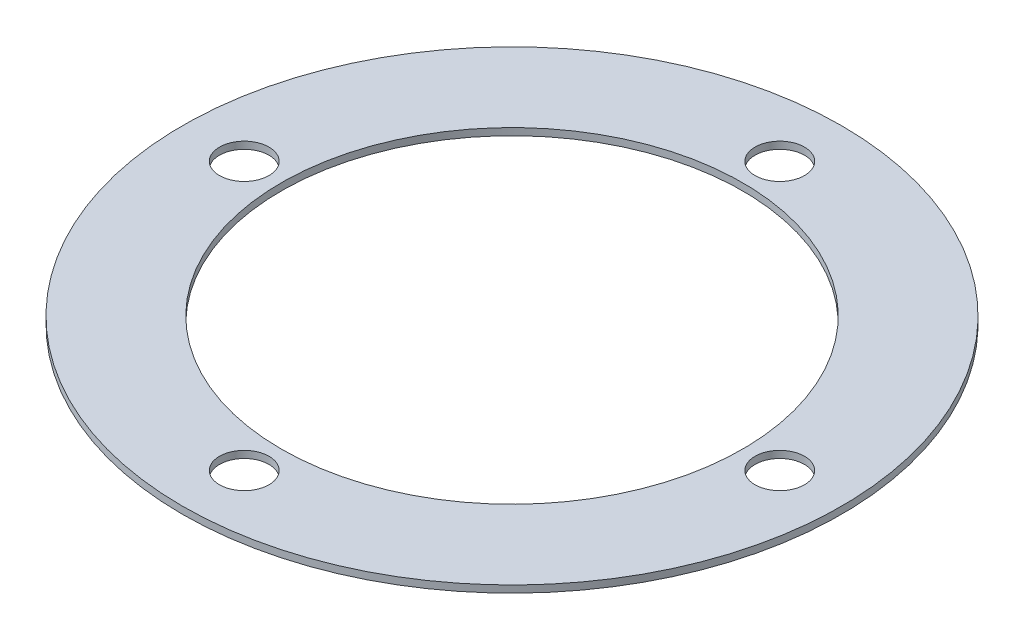
ISO-10303-21;
HEADER;
FILE_DESCRIPTION(('STEP AP214'),'2;1');
FILE_NAME('part.step','',(''),(''),'','','');
FILE_SCHEMA(('AUTOMOTIVE_DESIGN { 1 0 10303 214 1 1 1 1 }'));
ENDSEC;
DATA;
#1=APPLICATION_CONTEXT('core data for automotive mechanical design processes');
#2=APPLICATION_PROTOCOL_DEFINITION('international standard','automotive_design',2000,#1);
#3=PRODUCT_CONTEXT('',#1,'mechanical');
#4=PRODUCT('Part','Part','',(#3));
#5=PRODUCT_RELATED_PRODUCT_CATEGORY('part','',(#4));
#6=PRODUCT_DEFINITION_FORMATION('','',#4);
#7=PRODUCT_DEFINITION_CONTEXT('part definition',#1,'design');
#8=PRODUCT_DEFINITION('design','',#6,#7);
#9=PRODUCT_DEFINITION_SHAPE('','',#8);
#10=(LENGTH_UNIT() NAMED_UNIT(*) SI_UNIT(.MILLI.,.METRE.));
#11=(NAMED_UNIT(*) PLANE_ANGLE_UNIT() SI_UNIT($,.RADIAN.));
#12=(NAMED_UNIT(*) SI_UNIT($,.STERADIAN.) SOLID_ANGLE_UNIT());
#13=UNCERTAINTY_MEASURE_WITH_UNIT(LENGTH_MEASURE(1.E-05),#10,'distance_accuracy_value','');
#14=(GEOMETRIC_REPRESENTATION_CONTEXT(3) GLOBAL_UNCERTAINTY_ASSIGNED_CONTEXT((#13)) GLOBAL_UNIT_ASSIGNED_CONTEXT((#10,
#11,#12)) REPRESENTATION_CONTEXT('',''));
#15=CARTESIAN_POINT('',(0.,0.,0.));
#16=DIRECTION('',(0.,0.,1.));
#17=DIRECTION('',(1.,0.,0.));
#18=AXIS2_PLACEMENT_3D('',#15,#16,#17);
#19=CARTESIAN_POINT('',(32.5,0.86,0.));
#20=DIRECTION('',(0.,-1.,0.));
#21=DIRECTION('',(0.,0.,-1.));
#22=AXIS2_PLACEMENT_3D('',#19,#20,#21);
#23=CYLINDRICAL_SURFACE('',#22,3.);
#24=CARTESIAN_POINT('',(32.5,0.86,0.));
#25=DIRECTION('',(0.,1.,0.));
#26=DIRECTION('',(0.,0.,1.));
#27=AXIS2_PLACEMENT_3D('',#24,#25,#26);
#28=CIRCLE('',#27,3.);
#29=CARTESIAN_POINT('',(32.5,0.86,3.));
#30=VERTEX_POINT('',#29);
#31=EDGE_CURVE('E41',#30,#30,#28,.T.);
#32=ORIENTED_EDGE('',*,*,#31,.T.);
#33=EDGE_LOOP('',(#32));
#34=FACE_BOUND('',#33,.T.);
#35=CARTESIAN_POINT('',(32.5,0.,0.));
#36=DIRECTION('',(0.,1.,0.));
#37=DIRECTION('',(0.,0.,1.));
#38=AXIS2_PLACEMENT_3D('',#35,#36,#37);
#39=CIRCLE('',#38,3.);
#40=CARTESIAN_POINT('',(32.5,0.,3.));
#41=VERTEX_POINT('',#40);
#42=EDGE_CURVE('E61',#41,#41,#39,.T.);
#43=ORIENTED_EDGE('',*,*,#42,.F.);
#44=EDGE_LOOP('',(#43));
#45=FACE_BOUND('',#44,.T.);
#46=ADVANCED_FACE('F33',(#34,#45),#23,.F.);
#47=CARTESIAN_POINT('',(0.,0.86,32.5));
#48=DIRECTION('',(0.,-1.,0.));
#49=DIRECTION('',(0.,0.,-1.));
#50=AXIS2_PLACEMENT_3D('',#47,#48,#49);
#51=CYLINDRICAL_SURFACE('',#50,3.);
#52=CARTESIAN_POINT('',(0.,0.86,32.5));
#53=DIRECTION('',(0.,1.,0.));
#54=DIRECTION('',(0.,0.,1.));
#55=AXIS2_PLACEMENT_3D('',#52,#53,#54);
#56=CIRCLE('',#55,3.);
#57=CARTESIAN_POINT('',(0.,0.86,35.5));
#58=VERTEX_POINT('',#57);
#59=EDGE_CURVE('E46',#58,#58,#56,.T.);
#60=ORIENTED_EDGE('',*,*,#59,.T.);
#61=EDGE_LOOP('',(#60));
#62=FACE_BOUND('',#61,.T.);
#63=CARTESIAN_POINT('',(0.,0.,32.5));
#64=DIRECTION('',(0.,1.,0.));
#65=DIRECTION('',(0.,0.,1.));
#66=AXIS2_PLACEMENT_3D('',#63,#64,#65);
#67=CIRCLE('',#66,3.);
#68=CARTESIAN_POINT('',(0.,0.,35.5));
#69=VERTEX_POINT('',#68);
#70=EDGE_CURVE('E59',#69,#69,#67,.T.);
#71=ORIENTED_EDGE('',*,*,#70,.F.);
#72=EDGE_LOOP('',(#71));
#73=FACE_BOUND('',#72,.T.);
#74=ADVANCED_FACE('F82',(#62,#73),#51,.F.);
#75=CARTESIAN_POINT('',(-32.5,0.86,0.));
#76=DIRECTION('',(0.,-1.,0.));
#77=DIRECTION('',(0.,0.,-1.));
#78=AXIS2_PLACEMENT_3D('',#75,#76,#77);
#79=CYLINDRICAL_SURFACE('',#78,3.);
#80=CARTESIAN_POINT('',(-32.5,0.86,0.));
#81=DIRECTION('',(0.,1.,0.));
#82=DIRECTION('',(0.,0.,1.));
#83=AXIS2_PLACEMENT_3D('',#80,#81,#82);
#84=CIRCLE('',#83,3.);
#85=CARTESIAN_POINT('',(-32.5,0.86,3.));
#86=VERTEX_POINT('',#85);
#87=EDGE_CURVE('E75',#86,#86,#84,.T.);
#88=ORIENTED_EDGE('',*,*,#87,.T.);
#89=EDGE_LOOP('',(#88));
#90=FACE_BOUND('',#89,.T.);
#91=CARTESIAN_POINT('',(-32.5,0.,0.));
#92=DIRECTION('',(0.,1.,0.));
#93=DIRECTION('',(0.,0.,1.));
#94=AXIS2_PLACEMENT_3D('',#91,#92,#93);
#95=CIRCLE('',#94,3.);
#96=CARTESIAN_POINT('',(-32.5,0.,3.));
#97=VERTEX_POINT('',#96);
#98=EDGE_CURVE('E56',#97,#97,#95,.T.);
#99=ORIENTED_EDGE('',*,*,#98,.F.);
#100=EDGE_LOOP('',(#99));
#101=FACE_BOUND('',#100,.T.);
#102=ADVANCED_FACE('F100',(#90,#101),#79,.F.);
#103=CARTESIAN_POINT('',(0.,0.86,-32.5));
#104=DIRECTION('',(0.,-1.,0.));
#105=DIRECTION('',(0.,0.,-1.));
#106=AXIS2_PLACEMENT_3D('',#103,#104,#105);
#107=CYLINDRICAL_SURFACE('',#106,3.);
#108=CARTESIAN_POINT('',(0.,0.86,-32.5));
#109=DIRECTION('',(0.,1.,0.));
#110=DIRECTION('',(0.,0.,1.));
#111=AXIS2_PLACEMENT_3D('',#108,#109,#110);
#112=CIRCLE('',#111,3.);
#113=CARTESIAN_POINT('',(0.,0.86,-29.5));
#114=VERTEX_POINT('',#113);
#115=EDGE_CURVE('E70',#114,#114,#112,.T.);
#116=ORIENTED_EDGE('',*,*,#115,.T.);
#117=EDGE_LOOP('',(#116));
#118=FACE_BOUND('',#117,.T.);
#119=CARTESIAN_POINT('',(0.,0.,-32.5));
#120=DIRECTION('',(0.,1.,0.));
#121=DIRECTION('',(0.,0.,1.));
#122=AXIS2_PLACEMENT_3D('',#119,#120,#121);
#123=CIRCLE('',#122,3.);
#124=CARTESIAN_POINT('',(0.,0.,-29.5));
#125=VERTEX_POINT('',#124);
#126=EDGE_CURVE('E53',#125,#125,#123,.T.);
#127=ORIENTED_EDGE('',*,*,#126,.F.);
#128=EDGE_LOOP('',(#127));
#129=FACE_BOUND('',#128,.T.);
#130=ADVANCED_FACE('F106',(#118,#129),#107,.F.);
#131=CARTESIAN_POINT('',(0.,0.86,0.));
#132=DIRECTION('',(0.,-1.,0.));
#133=DIRECTION('',(0.,0.,-1.));
#134=AXIS2_PLACEMENT_3D('',#131,#132,#133);
#135=CYLINDRICAL_SURFACE('',#134,28.);
#136=CARTESIAN_POINT('',(0.,0.86,0.));
#137=DIRECTION('',(0.,1.,0.));
#138=DIRECTION('',(0.,0.,1.));
#139=AXIS2_PLACEMENT_3D('',#136,#137,#138);
#140=CIRCLE('',#139,28.);
#141=CARTESIAN_POINT('',(0.,0.86,28.));
#142=VERTEX_POINT('',#141);
#143=EDGE_CURVE('E66',#142,#142,#140,.T.);
#144=ORIENTED_EDGE('',*,*,#143,.T.);
#145=EDGE_LOOP('',(#144));
#146=FACE_BOUND('',#145,.T.);
#147=CARTESIAN_POINT('',(0.,0.,0.));
#148=DIRECTION('',(0.,1.,0.));
#149=DIRECTION('',(0.,0.,1.));
#150=AXIS2_PLACEMENT_3D('',#147,#148,#149);
#151=CIRCLE('',#150,28.);
#152=CARTESIAN_POINT('',(0.,0.,28.));
#153=VERTEX_POINT('',#152);
#154=EDGE_CURVE('E50',#153,#153,#151,.T.);
#155=ORIENTED_EDGE('',*,*,#154,.F.);
#156=EDGE_LOOP('',(#155));
#157=FACE_BOUND('',#156,.T.);
#158=ADVANCED_FACE('F35',(#146,#157),#135,.F.);
#159=CARTESIAN_POINT('',(0.,0.86,0.));
#160=DIRECTION('',(0.,-1.,0.));
#161=DIRECTION('',(0.,0.,-1.));
#162=AXIS2_PLACEMENT_3D('',#159,#160,#161);
#163=CYLINDRICAL_SURFACE('',#162,40.);
#164=CARTESIAN_POINT('',(0.,0.86,0.));
#165=DIRECTION('',(0.,1.,0.));
#166=DIRECTION('',(0.,0.,1.));
#167=AXIS2_PLACEMENT_3D('',#164,#165,#166);
#168=CIRCLE('',#167,40.);
#169=CARTESIAN_POINT('',(0.,0.86,40.));
#170=VERTEX_POINT('',#169);
#171=EDGE_CURVE('E10',#170,#170,#168,.T.);
#172=ORIENTED_EDGE('',*,*,#171,.F.);
#173=EDGE_LOOP('',(#172));
#174=FACE_BOUND('',#173,.T.);
#175=CARTESIAN_POINT('',(0.,0.,0.));
#176=DIRECTION('',(0.,1.,0.));
#177=DIRECTION('',(0.,0.,1.));
#178=AXIS2_PLACEMENT_3D('',#175,#176,#177);
#179=CIRCLE('',#178,40.);
#180=CARTESIAN_POINT('',(0.,0.,40.));
#181=VERTEX_POINT('',#180);
#182=EDGE_CURVE('E37',#181,#181,#179,.T.);
#183=ORIENTED_EDGE('',*,*,#182,.T.);
#184=EDGE_LOOP('',(#183));
#185=FACE_BOUND('',#184,.T.);
#186=ADVANCED_FACE('F89',(#174,#185),#163,.T.);
#187=CARTESIAN_POINT('',(0.,0.86,0.));
#188=DIRECTION('',(0.,1.,0.));
#189=DIRECTION('',(0.,0.,1.));
#190=AXIS2_PLACEMENT_3D('',#187,#188,#189);
#191=PLANE('',#190);
#192=ORIENTED_EDGE('',*,*,#143,.F.);
#193=EDGE_LOOP('',(#192));
#194=FACE_BOUND('',#193,.T.);
#195=ORIENTED_EDGE('',*,*,#115,.F.);
#196=EDGE_LOOP('',(#195));
#197=FACE_BOUND('',#196,.T.);
#198=ORIENTED_EDGE('',*,*,#87,.F.);
#199=EDGE_LOOP('',(#198));
#200=FACE_BOUND('',#199,.T.);
#201=ORIENTED_EDGE('',*,*,#59,.F.);
#202=EDGE_LOOP('',(#201));
#203=FACE_BOUND('',#202,.T.);
#204=ORIENTED_EDGE('',*,*,#31,.F.);
#205=EDGE_LOOP('',(#204));
#206=FACE_BOUND('',#205,.T.);
#207=ORIENTED_EDGE('',*,*,#171,.T.);
#208=EDGE_LOOP('',(#207));
#209=FACE_BOUND('',#208,.T.);
#210=ADVANCED_FACE('F85',(#194,#197,#200,#203,#206,#209),#191,.T.);
#211=CARTESIAN_POINT('',(0.,0.,0.));
#212=DIRECTION('',(0.,1.,0.));
#213=DIRECTION('',(0.,0.,1.));
#214=AXIS2_PLACEMENT_3D('',#211,#212,#213);
#215=PLANE('',#214);
#216=ORIENTED_EDGE('',*,*,#154,.T.);
#217=EDGE_LOOP('',(#216));
#218=FACE_BOUND('',#217,.T.);
#219=ORIENTED_EDGE('',*,*,#126,.T.);
#220=EDGE_LOOP('',(#219));
#221=FACE_BOUND('',#220,.T.);
#222=ORIENTED_EDGE('',*,*,#98,.T.);
#223=EDGE_LOOP('',(#222));
#224=FACE_BOUND('',#223,.T.);
#225=ORIENTED_EDGE('',*,*,#70,.T.);
#226=EDGE_LOOP('',(#225));
#227=FACE_BOUND('',#226,.T.);
#228=ORIENTED_EDGE('',*,*,#42,.T.);
#229=EDGE_LOOP('',(#228));
#230=FACE_BOUND('',#229,.T.);
#231=ORIENTED_EDGE('',*,*,#182,.F.);
#232=EDGE_LOOP('',(#231));
#233=FACE_BOUND('',#232,.T.);
#234=ADVANCED_FACE('F88',(#218,#221,#224,#227,#230,#233),#215,.F.);
#235=CLOSED_SHELL('',(#46,#74,#102,#130,#158,#186,#210,#234));
#236=MANIFOLD_SOLID_BREP('B2',#235);
#237=ADVANCED_BREP_SHAPE_REPRESENTATION('',(#18,#236),#14);
#238=SHAPE_DEFINITION_REPRESENTATION(#9,#237);
ENDSEC;
END-ISO-10303-21;
